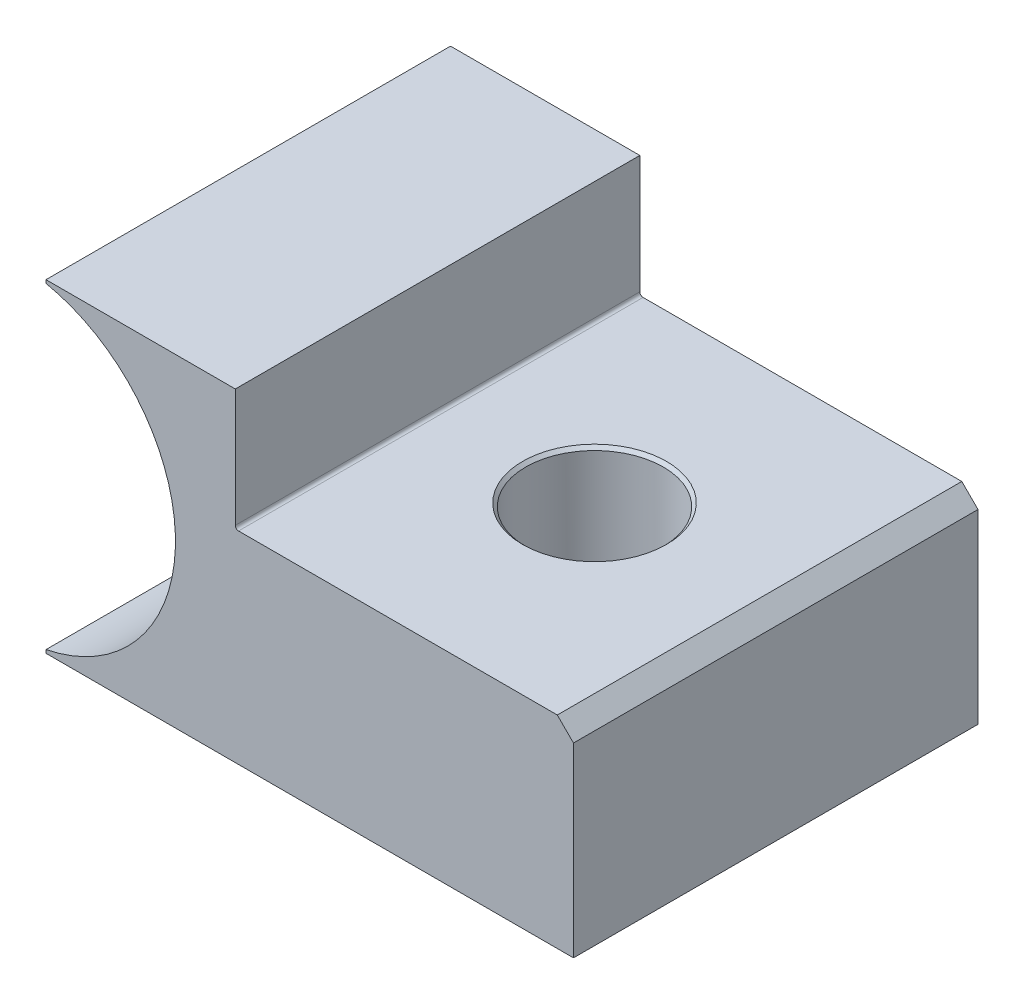
ISO-10303-21;
HEADER;
FILE_DESCRIPTION(('STEP AP214'),'2;1');
FILE_NAME('part.step','',(''),(''),'','','');
FILE_SCHEMA(('AUTOMOTIVE_DESIGN { 1 0 10303 214 1 1 1 1 }'));
ENDSEC;
DATA;
#1=APPLICATION_CONTEXT('core data for automotive mechanical design processes');
#2=APPLICATION_PROTOCOL_DEFINITION('international standard','automotive_design',2000,#1);
#3=PRODUCT_CONTEXT('',#1,'mechanical');
#4=PRODUCT('Part','Part','',(#3));
#5=PRODUCT_RELATED_PRODUCT_CATEGORY('part','',(#4));
#6=PRODUCT_DEFINITION_FORMATION('','',#4);
#7=PRODUCT_DEFINITION_CONTEXT('part definition',#1,'design');
#8=PRODUCT_DEFINITION('design','',#6,#7);
#9=PRODUCT_DEFINITION_SHAPE('','',#8);
#10=(LENGTH_UNIT() NAMED_UNIT(*) SI_UNIT(.MILLI.,.METRE.));
#11=(NAMED_UNIT(*) PLANE_ANGLE_UNIT() SI_UNIT($,.RADIAN.));
#12=(NAMED_UNIT(*) SI_UNIT($,.STERADIAN.) SOLID_ANGLE_UNIT());
#13=UNCERTAINTY_MEASURE_WITH_UNIT(LENGTH_MEASURE(1.E-05),#10,'distance_accuracy_value','');
#14=(GEOMETRIC_REPRESENTATION_CONTEXT(3) GLOBAL_UNCERTAINTY_ASSIGNED_CONTEXT((#13)) GLOBAL_UNIT_ASSIGNED_CONTEXT((#10,
#11,#12)) REPRESENTATION_CONTEXT('',''));
#15=CARTESIAN_POINT('',(0.,0.,0.));
#16=DIRECTION('',(0.,0.,1.));
#17=DIRECTION('',(1.,0.,0.));
#18=AXIS2_PLACEMENT_3D('',#15,#16,#17);
#19=CARTESIAN_POINT('',(2.54,25.4,31.75));
#20=DIRECTION('',(1.,0.,0.));
#21=DIRECTION('',(0.,0.,-1.));
#22=AXIS2_PLACEMENT_3D('',#19,#20,#21);
#23=PLANE('',#22);
#24=DIRECTION('',(0.,-1.,0.));
#25=VECTOR('',#24,1.);
#26=CARTESIAN_POINT('',(2.54,25.4,0.));
#27=LINE('',#26,#25);
#28=CARTESIAN_POINT('',(2.54,25.4,0.));
#29=VERTEX_POINT('',#28);
#30=CARTESIAN_POINT('',(2.54,25.1434078933385,0.));
#31=VERTEX_POINT('',#30);
#32=EDGE_CURVE('E157',#29,#31,#27,.T.);
#33=ORIENTED_EDGE('',*,*,#32,.T.);
#34=DIRECTION('',(0.,0.,-1.));
#35=VECTOR('',#34,1.);
#36=CARTESIAN_POINT('',(2.54,25.1434078933385,31.75));
#37=LINE('',#36,#35);
#38=CARTESIAN_POINT('',(2.54,25.1434078933385,31.75));
#39=VERTEX_POINT('',#38);
#40=EDGE_CURVE('E135',#39,#31,#37,.T.);
#41=ORIENTED_EDGE('',*,*,#40,.F.);
#42=DIRECTION('',(0.,-1.,0.));
#43=VECTOR('',#42,1.);
#44=CARTESIAN_POINT('',(2.54,25.4,31.75));
#45=LINE('',#44,#43);
#46=CARTESIAN_POINT('',(2.54,25.4,31.75));
#47=VERTEX_POINT('',#46);
#48=EDGE_CURVE('E143',#47,#39,#45,.T.);
#49=ORIENTED_EDGE('',*,*,#48,.F.);
#50=DIRECTION('',(0.,0.,-1.));
#51=VECTOR('',#50,1.);
#52=CARTESIAN_POINT('',(2.54,25.4,31.75));
#53=LINE('',#52,#51);
#54=EDGE_CURVE('E214',#47,#29,#53,.T.);
#55=ORIENTED_EDGE('',*,*,#54,.T.);
#56=EDGE_LOOP('',(#33,#41,#49,#55));
#57=FACE_BOUND('',#56,.T.);
#58=ADVANCED_FACE('F53',(#57),#23,.F.);
#59=CARTESIAN_POINT('',(0.,12.7,31.75));
#60=DIRECTION('',(0.,0.,-1.));
#61=DIRECTION('',(-1.,0.,0.));
#62=AXIS2_PLACEMENT_3D('',#59,#60,#61);
#63=CYLINDRICAL_SURFACE('',#62,12.7);
#64=CARTESIAN_POINT('',(0.,12.7,0.));
#65=DIRECTION('',(0.,0.,-1.));
#66=DIRECTION('',(1.,0.,0.));
#67=AXIS2_PLACEMENT_3D('',#64,#65,#66);
#68=CIRCLE('',#67,12.7);
#69=CARTESIAN_POINT('',(2.54,0.256592106661457,0.));
#70=VERTEX_POINT('',#69);
#71=EDGE_CURVE('E242',#31,#70,#68,.T.);
#72=ORIENTED_EDGE('',*,*,#71,.T.);
#73=DIRECTION('',(0.,0.,-1.));
#74=VECTOR('',#73,1.);
#75=CARTESIAN_POINT('',(2.54,0.256592106661457,31.75));
#76=LINE('',#75,#74);
#77=CARTESIAN_POINT('',(2.54,0.256592106661457,31.75));
#78=VERTEX_POINT('',#77);
#79=EDGE_CURVE('E138',#78,#70,#76,.T.);
#80=ORIENTED_EDGE('',*,*,#79,.F.);
#81=CARTESIAN_POINT('',(0.,12.7,31.75));
#82=DIRECTION('',(0.,0.,-1.));
#83=DIRECTION('',(1.,0.,0.));
#84=AXIS2_PLACEMENT_3D('',#81,#82,#83);
#85=CIRCLE('',#84,12.7);
#86=EDGE_CURVE('E131',#39,#78,#85,.T.);
#87=ORIENTED_EDGE('',*,*,#86,.F.);
#88=ORIENTED_EDGE('',*,*,#40,.T.);
#89=EDGE_LOOP('',(#72,#80,#87,#88));
#90=FACE_BOUND('',#89,.T.);
#91=ADVANCED_FACE('F133',(#90),#63,.F.);
#92=CARTESIAN_POINT('',(2.54,0.256592106661457,31.75));
#93=DIRECTION('',(1.,0.,0.));
#94=DIRECTION('',(0.,1.,0.));
#95=AXIS2_PLACEMENT_3D('',#92,#93,#94);
#96=PLANE('',#95);
#97=DIRECTION('',(0.,-1.,0.));
#98=VECTOR('',#97,1.);
#99=CARTESIAN_POINT('',(2.54,0.256592106661457,0.));
#100=LINE('',#99,#98);
#101=CARTESIAN_POINT('',(2.54,0.,0.));
#102=VERTEX_POINT('',#101);
#103=EDGE_CURVE('E236',#70,#102,#100,.T.);
#104=ORIENTED_EDGE('',*,*,#103,.T.);
#105=DIRECTION('',(0.,0.,-1.));
#106=VECTOR('',#105,1.);
#107=CARTESIAN_POINT('',(2.54,0.,31.75));
#108=LINE('',#107,#106);
#109=CARTESIAN_POINT('',(2.54,0.,31.75));
#110=VERTEX_POINT('',#109);
#111=EDGE_CURVE('E166',#110,#102,#108,.T.);
#112=ORIENTED_EDGE('',*,*,#111,.F.);
#113=DIRECTION('',(0.,-1.,0.));
#114=VECTOR('',#113,1.);
#115=CARTESIAN_POINT('',(2.54,0.256592106661457,31.75));
#116=LINE('',#115,#114);
#117=EDGE_CURVE('E142',#78,#110,#116,.T.);
#118=ORIENTED_EDGE('',*,*,#117,.F.);
#119=ORIENTED_EDGE('',*,*,#79,.T.);
#120=EDGE_LOOP('',(#104,#112,#118,#119));
#121=FACE_BOUND('',#120,.T.);
#122=ADVANCED_FACE('F289',(#121),#96,.F.);
#123=CARTESIAN_POINT('',(2.54,0.,31.75));
#124=DIRECTION('',(0.,1.,0.));
#125=DIRECTION('',(-1.,0.,0.));
#126=AXIS2_PLACEMENT_3D('',#123,#124,#125);
#127=PLANE('',#126);
#128=CARTESIAN_POINT('',(29.718,0.,15.875));
#129=DIRECTION('',(0.,1.,0.));
#130=DIRECTION('',(0.,0.,1.));
#131=AXIS2_PLACEMENT_3D('',#128,#129,#130);
#132=CIRCLE('',#131,5.39749999999999);
#133=CARTESIAN_POINT('',(29.718,0.,21.2725));
#134=VERTEX_POINT('',#133);
#135=EDGE_CURVE('E249',#134,#134,#132,.T.);
#136=ORIENTED_EDGE('',*,*,#135,.T.);
#137=EDGE_LOOP('',(#136));
#138=FACE_BOUND('',#137,.T.);
#139=DIRECTION('',(1.,0.,0.));
#140=VECTOR('',#139,1.);
#141=CARTESIAN_POINT('',(2.54,0.,0.));
#142=LINE('',#141,#140);
#143=CARTESIAN_POINT('',(43.942,0.,0.));
#144=VERTEX_POINT('',#143);
#145=EDGE_CURVE('E231',#102,#144,#142,.T.);
#146=ORIENTED_EDGE('',*,*,#145,.T.);
#147=DIRECTION('',(0.,0.,-1.));
#148=VECTOR('',#147,1.);
#149=CARTESIAN_POINT('',(43.942,0.,31.75));
#150=LINE('',#149,#148);
#151=CARTESIAN_POINT('',(43.942,0.,31.75));
#152=VERTEX_POINT('',#151);
#153=EDGE_CURVE('E220',#152,#144,#150,.T.);
#154=ORIENTED_EDGE('',*,*,#153,.F.);
#155=DIRECTION('',(1.,0.,0.));
#156=VECTOR('',#155,1.);
#157=CARTESIAN_POINT('',(2.54,0.,31.75));
#158=LINE('',#157,#156);
#159=EDGE_CURVE('E232',#110,#152,#158,.T.);
#160=ORIENTED_EDGE('',*,*,#159,.F.);
#161=ORIENTED_EDGE('',*,*,#111,.T.);
#162=EDGE_LOOP('',(#146,#154,#160,#161));
#163=FACE_BOUND('',#162,.T.);
#164=ADVANCED_FACE('F229',(#138,#163),#127,.F.);
#165=CARTESIAN_POINT('',(43.942,0.,31.75));
#166=DIRECTION('',(-1.,0.,0.));
#167=DIRECTION('',(0.,0.,1.));
#168=AXIS2_PLACEMENT_3D('',#165,#166,#167);
#169=PLANE('',#168);
#170=DIRECTION('',(0.,1.,0.));
#171=VECTOR('',#170,1.);
#172=CARTESIAN_POINT('',(43.942,0.,0.));
#173=LINE('',#172,#171);
#174=CARTESIAN_POINT('',(43.942,14.605,0.));
#175=VERTEX_POINT('',#174);
#176=EDGE_CURVE('E210',#144,#175,#173,.T.);
#177=ORIENTED_EDGE('',*,*,#176,.T.);
#178=DIRECTION('',(0.,0.,1.));
#179=VECTOR('',#178,1.);
#180=CARTESIAN_POINT('',(43.942,14.605,31.75));
#181=LINE('',#180,#179);
#182=CARTESIAN_POINT('',(43.942,14.605,31.75));
#183=VERTEX_POINT('',#182);
#184=EDGE_CURVE('E172',#175,#183,#181,.T.);
#185=ORIENTED_EDGE('',*,*,#184,.T.);
#186=DIRECTION('',(0.,1.,0.));
#187=VECTOR('',#186,1.);
#188=CARTESIAN_POINT('',(43.942,0.,31.75));
#189=LINE('',#188,#187);
#190=EDGE_CURVE('E257',#152,#183,#189,.T.);
#191=ORIENTED_EDGE('',*,*,#190,.F.);
#192=ORIENTED_EDGE('',*,*,#153,.T.);
#193=EDGE_LOOP('',(#177,#185,#191,#192));
#194=FACE_BOUND('',#193,.T.);
#195=ADVANCED_FACE('F308',(#194),#169,.F.);
#196=CARTESIAN_POINT('',(17.399,15.875,31.75));
#197=DIRECTION('',(0.,-1.,0.));
#198=DIRECTION('',(1.,0.,0.));
#199=AXIS2_PLACEMENT_3D('',#196,#197,#198);
#200=PLANE('',#199);
#201=CARTESIAN_POINT('',(29.718,15.875,15.875));
#202=DIRECTION('',(0.,-1.,0.));
#203=DIRECTION('',(1.,0.,0.));
#204=AXIS2_PLACEMENT_3D('',#201,#202,#203);
#205=CIRCLE('',#204,5.6515);
#206=CARTESIAN_POINT('',(35.3695,15.875,15.875));
#207=VERTEX_POINT('',#206);
#208=EDGE_CURVE('E182',#207,#207,#205,.T.);
#209=ORIENTED_EDGE('',*,*,#208,.T.);
#210=EDGE_LOOP('',(#209));
#211=FACE_BOUND('',#210,.T.);
#212=DIRECTION('',(-1.,0.,0.));
#213=VECTOR('',#212,1.);
#214=CARTESIAN_POINT('',(17.399,15.875,0.));
#215=LINE('',#214,#213);
#216=CARTESIAN_POINT('',(42.672,15.875,0.));
#217=VERTEX_POINT('',#216);
#218=CARTESIAN_POINT('',(17.653,15.875,0.));
#219=VERTEX_POINT('',#218);
#220=EDGE_CURVE('E205',#217,#219,#215,.T.);
#221=ORIENTED_EDGE('',*,*,#220,.T.);
#222=DIRECTION('',(0.,0.,-1.));
#223=VECTOR('',#222,1.);
#224=CARTESIAN_POINT('',(17.653,15.875,31.75));
#225=LINE('',#224,#223);
#226=CARTESIAN_POINT('',(17.653,15.875,31.75));
#227=VERTEX_POINT('',#226);
#228=EDGE_CURVE('E75',#219,#227,#225,.F.);
#229=ORIENTED_EDGE('',*,*,#228,.T.);
#230=DIRECTION('',(-1.,0.,0.));
#231=VECTOR('',#230,1.);
#232=CARTESIAN_POINT('',(17.399,15.875,31.75));
#233=LINE('',#232,#231);
#234=CARTESIAN_POINT('',(42.672,15.875,31.75));
#235=VERTEX_POINT('',#234);
#236=EDGE_CURVE('E254',#235,#227,#233,.T.);
#237=ORIENTED_EDGE('',*,*,#236,.F.);
#238=DIRECTION('',(0.,0.,-1.));
#239=VECTOR('',#238,1.);
#240=CARTESIAN_POINT('',(42.672,15.875,31.75));
#241=LINE('',#240,#239);
#242=EDGE_CURVE('E159',#235,#217,#241,.T.);
#243=ORIENTED_EDGE('',*,*,#242,.T.);
#244=EDGE_LOOP('',(#221,#229,#237,#243));
#245=FACE_BOUND('',#244,.T.);
#246=ADVANCED_FACE('F307',(#211,#245),#200,.F.);
#247=CARTESIAN_POINT('',(17.399,25.4,31.75));
#248=DIRECTION('',(-1.,0.,0.));
#249=DIRECTION('',(0.,-1.,0.));
#250=AXIS2_PLACEMENT_3D('',#247,#248,#249);
#251=PLANE('',#250);
#252=DIRECTION('',(0.,1.,0.));
#253=VECTOR('',#252,1.);
#254=CARTESIAN_POINT('',(17.399,25.4,31.75));
#255=LINE('',#254,#253);
#256=CARTESIAN_POINT('',(17.399,16.129,31.75));
#257=VERTEX_POINT('',#256);
#258=CARTESIAN_POINT('',(17.399,25.4,31.75));
#259=VERTEX_POINT('',#258);
#260=EDGE_CURVE('E199',#257,#259,#255,.T.);
#261=ORIENTED_EDGE('',*,*,#260,.F.);
#262=DIRECTION('',(0.,0.,-1.));
#263=VECTOR('',#262,1.);
#264=CARTESIAN_POINT('',(17.399,16.129,0.));
#265=LINE('',#264,#263);
#266=CARTESIAN_POINT('',(17.399,16.129,0.));
#267=VERTEX_POINT('',#266);
#268=EDGE_CURVE('E186',#257,#267,#265,.T.);
#269=ORIENTED_EDGE('',*,*,#268,.T.);
#270=DIRECTION('',(0.,1.,0.));
#271=VECTOR('',#270,1.);
#272=CARTESIAN_POINT('',(17.399,25.4,0.));
#273=LINE('',#272,#271);
#274=CARTESIAN_POINT('',(17.399,25.4,0.));
#275=VERTEX_POINT('',#274);
#276=EDGE_CURVE('E197',#267,#275,#273,.T.);
#277=ORIENTED_EDGE('',*,*,#276,.T.);
#278=DIRECTION('',(0.,0.,-1.));
#279=VECTOR('',#278,1.);
#280=CARTESIAN_POINT('',(17.399,25.4,31.75));
#281=LINE('',#280,#279);
#282=EDGE_CURVE('E217',#259,#275,#281,.T.);
#283=ORIENTED_EDGE('',*,*,#282,.F.);
#284=EDGE_LOOP('',(#261,#269,#277,#283));
#285=FACE_BOUND('',#284,.T.);
#286=ADVANCED_FACE('F195',(#285),#251,.F.);
#287=CARTESIAN_POINT('',(2.54,25.4,31.75));
#288=DIRECTION('',(0.,-1.,0.));
#289=DIRECTION('',(1.,0.,0.));
#290=AXIS2_PLACEMENT_3D('',#287,#288,#289);
#291=PLANE('',#290);
#292=DIRECTION('',(-1.,0.,0.));
#293=VECTOR('',#292,1.);
#294=CARTESIAN_POINT('',(2.54,25.4,0.));
#295=LINE('',#294,#293);
#296=EDGE_CURVE('E154',#275,#29,#295,.T.);
#297=ORIENTED_EDGE('',*,*,#296,.T.);
#298=ORIENTED_EDGE('',*,*,#54,.F.);
#299=DIRECTION('',(-1.,0.,0.));
#300=VECTOR('',#299,1.);
#301=CARTESIAN_POINT('',(2.54,25.4,31.75));
#302=LINE('',#301,#300);
#303=EDGE_CURVE('E149',#259,#47,#302,.T.);
#304=ORIENTED_EDGE('',*,*,#303,.F.);
#305=ORIENTED_EDGE('',*,*,#282,.T.);
#306=EDGE_LOOP('',(#297,#298,#304,#305));
#307=FACE_BOUND('',#306,.T.);
#308=ADVANCED_FACE('F326',(#307),#291,.F.);
#309=CARTESIAN_POINT('',(0.,12.7,31.75));
#310=DIRECTION('',(0.,0.,1.));
#311=DIRECTION('',(1.,0.,0.));
#312=AXIS2_PLACEMENT_3D('',#309,#310,#311);
#313=PLANE('',#312);
#314=ORIENTED_EDGE('',*,*,#190,.T.);
#315=DIRECTION('',(0.707106781186544,-0.707106781186551,0.));
#316=VECTOR('',#315,1.);
#317=CARTESIAN_POINT('',(22.9235000000002,35.6235,31.75));
#318=LINE('',#317,#316);
#319=EDGE_CURVE('E175',#183,#235,#318,.F.);
#320=ORIENTED_EDGE('',*,*,#319,.T.);
#321=ORIENTED_EDGE('',*,*,#236,.T.);
#322=CARTESIAN_POINT('',(17.653,16.129,31.75));
#323=DIRECTION('',(0.,0.,1.));
#324=DIRECTION('',(1.,0.,0.));
#325=AXIS2_PLACEMENT_3D('',#322,#323,#324);
#326=CIRCLE('',#325,0.254);
#327=EDGE_CURVE('E12',#227,#257,#326,.F.);
#328=ORIENTED_EDGE('',*,*,#327,.T.);
#329=ORIENTED_EDGE('',*,*,#260,.T.);
#330=ORIENTED_EDGE('',*,*,#303,.T.);
#331=ORIENTED_EDGE('',*,*,#48,.T.);
#332=ORIENTED_EDGE('',*,*,#86,.T.);
#333=ORIENTED_EDGE('',*,*,#117,.T.);
#334=ORIENTED_EDGE('',*,*,#159,.T.);
#335=EDGE_LOOP('',(#314,#320,#321,#328,#329,#330,#331,#332,#333,#334));
#336=FACE_BOUND('',#335,.T.);
#337=ADVANCED_FACE('F147',(#336),#313,.T.);
#338=CARTESIAN_POINT('',(0.,12.7,0.));
#339=DIRECTION('',(0.,0.,1.));
#340=DIRECTION('',(1.,0.,0.));
#341=AXIS2_PLACEMENT_3D('',#338,#339,#340);
#342=PLANE('',#341);
#343=ORIENTED_EDGE('',*,*,#220,.F.);
#344=DIRECTION('',(-0.707106781186544,0.707106781186551,0.));
#345=VECTOR('',#344,1.);
#346=CARTESIAN_POINT('',(42.672,15.875,0.));
#347=LINE('',#346,#345);
#348=EDGE_CURVE('E164',#217,#175,#347,.F.);
#349=ORIENTED_EDGE('',*,*,#348,.T.);
#350=ORIENTED_EDGE('',*,*,#176,.F.);
#351=ORIENTED_EDGE('',*,*,#145,.F.);
#352=ORIENTED_EDGE('',*,*,#103,.F.);
#353=ORIENTED_EDGE('',*,*,#71,.F.);
#354=ORIENTED_EDGE('',*,*,#32,.F.);
#355=ORIENTED_EDGE('',*,*,#296,.F.);
#356=ORIENTED_EDGE('',*,*,#276,.F.);
#357=CARTESIAN_POINT('',(17.653,16.129,0.));
#358=DIRECTION('',(0.,0.,1.));
#359=DIRECTION('',(1.,0.,0.));
#360=AXIS2_PLACEMENT_3D('',#357,#358,#359);
#361=CIRCLE('',#360,0.254);
#362=EDGE_CURVE('E62',#267,#219,#361,.T.);
#363=ORIENTED_EDGE('',*,*,#362,.T.);
#364=EDGE_LOOP('',(#343,#349,#350,#351,#352,#353,#354,#355,#356,#363));
#365=FACE_BOUND('',#364,.T.);
#366=ADVANCED_FACE('F203',(#365),#342,.F.);
#367=CARTESIAN_POINT('',(29.718,15.875,15.875));
#368=DIRECTION('',(0.,1.,0.));
#369=DIRECTION('',(0.,0.,1.));
#370=AXIS2_PLACEMENT_3D('',#367,#368,#369);
#371=CYLINDRICAL_SURFACE('',#370,5.3975);
#372=CARTESIAN_POINT('',(29.718,15.621,15.875));
#373=DIRECTION('',(0.,-1.,0.));
#374=DIRECTION('',(0.,0.,-1.));
#375=AXIS2_PLACEMENT_3D('',#372,#373,#374);
#376=CIRCLE('',#375,5.3975);
#377=CARTESIAN_POINT('',(29.718,15.621,10.4775));
#378=VERTEX_POINT('',#377);
#379=EDGE_CURVE('E178',#378,#378,#376,.F.);
#380=ORIENTED_EDGE('',*,*,#379,.T.);
#381=EDGE_LOOP('',(#380));
#382=FACE_BOUND('',#381,.T.);
#383=ORIENTED_EDGE('',*,*,#135,.F.);
#384=EDGE_LOOP('',(#383));
#385=FACE_BOUND('',#384,.T.);
#386=ADVANCED_FACE('F269',(#382,#385),#371,.F.);
#387=CARTESIAN_POINT('',(42.672,15.875,31.75));
#388=DIRECTION('',(-0.707106781186551,-0.707106781186544,0.));
#389=DIRECTION('',(0.,0.,-1.));
#390=AXIS2_PLACEMENT_3D('',#387,#388,#389);
#391=PLANE('',#390);
#392=ORIENTED_EDGE('',*,*,#319,.F.);
#393=ORIENTED_EDGE('',*,*,#184,.F.);
#394=ORIENTED_EDGE('',*,*,#348,.F.);
#395=ORIENTED_EDGE('',*,*,#242,.F.);
#396=EDGE_LOOP('',(#392,#393,#394,#395));
#397=FACE_BOUND('',#396,.T.);
#398=ADVANCED_FACE('F271',(#397),#391,.F.);
#399=CARTESIAN_POINT('',(29.718,15.621,15.875));
#400=DIRECTION('',(0.,1.,0.));
#401=DIRECTION('',(0.,0.,1.));
#402=AXIS2_PLACEMENT_3D('',#399,#400,#401);
#403=CONICAL_SURFACE('',#402,5.3975,0.785398163397448);
#404=ORIENTED_EDGE('',*,*,#208,.F.);
#405=EDGE_LOOP('',(#404));
#406=FACE_BOUND('',#405,.T.);
#407=ORIENTED_EDGE('',*,*,#379,.F.);
#408=EDGE_LOOP('',(#407));
#409=FACE_BOUND('',#408,.T.);
#410=ADVANCED_FACE('F278',(#406,#409),#403,.F.);
#411=CARTESIAN_POINT('',(17.653,16.129,31.75));
#412=DIRECTION('',(0.,0.,1.));
#413=DIRECTION('',(1.,0.,0.));
#414=AXIS2_PLACEMENT_3D('',#411,#412,#413);
#415=CYLINDRICAL_SURFACE('',#414,0.254);
#416=ORIENTED_EDGE('',*,*,#327,.F.);
#417=ORIENTED_EDGE('',*,*,#228,.F.);
#418=ORIENTED_EDGE('',*,*,#362,.F.);
#419=ORIENTED_EDGE('',*,*,#268,.F.);
#420=EDGE_LOOP('',(#416,#417,#418,#419));
#421=FACE_BOUND('',#420,.T.);
#422=ADVANCED_FACE('F55',(#421),#415,.F.);
#423=CLOSED_SHELL('',(#58,#91,#122,#164,#195,#246,#286,#308,#337,#366,#386,#398,#410,#422));
#424=MANIFOLD_SOLID_BREP('B2',#423);
#425=ADVANCED_BREP_SHAPE_REPRESENTATION('',(#18,#424),#14);
#426=SHAPE_DEFINITION_REPRESENTATION(#9,#425);
ENDSEC;
END-ISO-10303-21;
